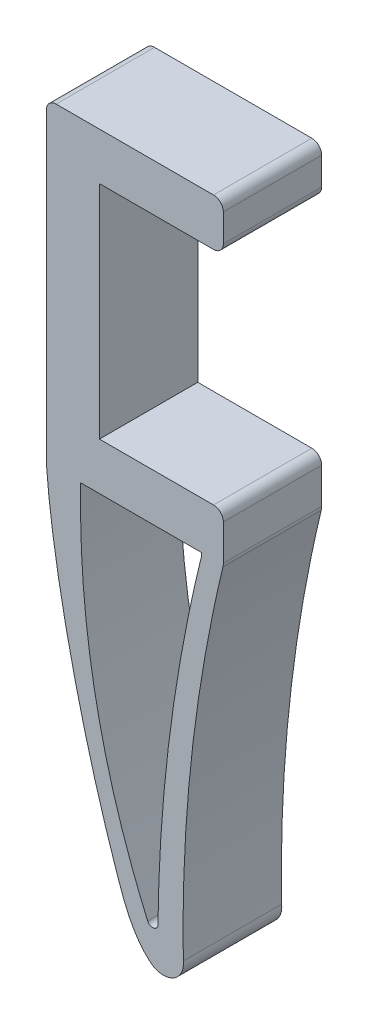
ISO-10303-21;
HEADER;
FILE_DESCRIPTION(('STEP AP214'),'2;1');
FILE_NAME('part.step','',(''),(''),'','','');
FILE_SCHEMA(('AUTOMOTIVE_DESIGN { 1 0 10303 214 1 1 1 1 }'));
ENDSEC;
DATA;
#1=APPLICATION_CONTEXT('core data for automotive mechanical design processes');
#2=APPLICATION_PROTOCOL_DEFINITION('international standard','automotive_design',2000,#1);
#3=PRODUCT_CONTEXT('',#1,'mechanical');
#4=PRODUCT('Part','Part','',(#3));
#5=PRODUCT_RELATED_PRODUCT_CATEGORY('part','',(#4));
#6=PRODUCT_DEFINITION_FORMATION('','',#4);
#7=PRODUCT_DEFINITION_CONTEXT('part definition',#1,'design');
#8=PRODUCT_DEFINITION('design','',#6,#7);
#9=PRODUCT_DEFINITION_SHAPE('','',#8);
#10=(LENGTH_UNIT() NAMED_UNIT(*) SI_UNIT(.MILLI.,.METRE.));
#11=(NAMED_UNIT(*) PLANE_ANGLE_UNIT() SI_UNIT($,.RADIAN.));
#12=(NAMED_UNIT(*) SI_UNIT($,.STERADIAN.) SOLID_ANGLE_UNIT());
#13=UNCERTAINTY_MEASURE_WITH_UNIT(LENGTH_MEASURE(1.E-05),#10,'distance_accuracy_value','');
#14=(GEOMETRIC_REPRESENTATION_CONTEXT(3) GLOBAL_UNCERTAINTY_ASSIGNED_CONTEXT((#13)) GLOBAL_UNIT_ASSIGNED_CONTEXT((#10,
#11,#12)) REPRESENTATION_CONTEXT('',''));
#15=CARTESIAN_POINT('',(0.,0.,0.));
#16=DIRECTION('',(0.,0.,1.));
#17=DIRECTION('',(1.,0.,0.));
#18=AXIS2_PLACEMENT_3D('',#15,#16,#17);
#19=CARTESIAN_POINT('',(-3.23658498725884,-50.5929421917792,10.));
#20=DIRECTION('',(0.,0.,-1.));
#21=DIRECTION('',(-1.,0.,0.));
#22=AXIS2_PLACEMENT_3D('',#19,#20,#21);
#23=PLANE('',#22);
#24=DIRECTION('',(0.,1.,0.));
#25=VECTOR('',#24,1.);
#26=CARTESIAN_POINT('',(0.,-31.9224715374172,10.));
#27=LINE('',#26,#25);
#28=CARTESIAN_POINT('',(0.,-31.9224715374172,10.));
#29=VERTEX_POINT('',#28);
#30=CARTESIAN_POINT('',(0.,-28.3,10.));
#31=VERTEX_POINT('',#30);
#32=EDGE_CURVE('E428',#29,#31,#27,.T.);
#33=ORIENTED_EDGE('',*,*,#32,.T.);
#34=CARTESIAN_POINT('',(-1.,-28.3,10.));
#35=DIRECTION('',(0.,0.,-1.));
#36=DIRECTION('',(-1.,0.,0.));
#37=AXIS2_PLACEMENT_3D('',#34,#35,#36);
#38=CIRCLE('',#37,1.);
#39=CARTESIAN_POINT('',(-1.,-27.3,10.));
#40=VERTEX_POINT('',#39);
#41=EDGE_CURVE('E382',#31,#40,#38,.F.);
#42=ORIENTED_EDGE('',*,*,#41,.T.);
#43=DIRECTION('',(-1.,0.,0.));
#44=VECTOR('',#43,1.);
#45=CARTESIAN_POINT('',(0.,-27.3,10.));
#46=LINE('',#45,#44);
#47=CARTESIAN_POINT('',(-12.6,-27.3,10.));
#48=VERTEX_POINT('',#47);
#49=EDGE_CURVE('E425',#40,#48,#46,.T.);
#50=ORIENTED_EDGE('',*,*,#49,.T.);
#51=DIRECTION('',(0.,1.,0.));
#52=VECTOR('',#51,1.);
#53=CARTESIAN_POINT('',(-12.6,-27.3,10.));
#54=LINE('',#53,#52);
#55=CARTESIAN_POINT('',(-12.6,-4.8,10.));
#56=VERTEX_POINT('',#55);
#57=EDGE_CURVE('E422',#48,#56,#54,.T.);
#58=ORIENTED_EDGE('',*,*,#57,.T.);
#59=DIRECTION('',(1.,0.,0.));
#60=VECTOR('',#59,1.);
#61=CARTESIAN_POINT('',(-12.6,-4.8,10.));
#62=LINE('',#61,#60);
#63=CARTESIAN_POINT('',(-1.,-4.8,10.));
#64=VERTEX_POINT('',#63);
#65=EDGE_CURVE('E419',#56,#64,#62,.T.);
#66=ORIENTED_EDGE('',*,*,#65,.T.);
#67=CARTESIAN_POINT('',(-1.,-3.8,10.));
#68=DIRECTION('',(0.,0.,-1.));
#69=DIRECTION('',(-1.,0.,0.));
#70=AXIS2_PLACEMENT_3D('',#67,#68,#69);
#71=CIRCLE('',#70,1.);
#72=CARTESIAN_POINT('',(0.,-3.8,10.));
#73=VERTEX_POINT('',#72);
#74=EDGE_CURVE('E55',#64,#73,#71,.F.);
#75=ORIENTED_EDGE('',*,*,#74,.T.);
#76=DIRECTION('',(0.,1.,0.));
#77=VECTOR('',#76,1.);
#78=CARTESIAN_POINT('',(0.,-4.8,10.));
#79=LINE('',#78,#77);
#80=CARTESIAN_POINT('',(0.,-1.,10.));
#81=VERTEX_POINT('',#80);
#82=EDGE_CURVE('E391',#73,#81,#79,.T.);
#83=ORIENTED_EDGE('',*,*,#82,.T.);
#84=CARTESIAN_POINT('',(-1.,-1.,10.));
#85=DIRECTION('',(0.,0.,1.));
#86=DIRECTION('',(1.,0.,0.));
#87=AXIS2_PLACEMENT_3D('',#84,#85,#86);
#88=CIRCLE('',#87,1.);
#89=CARTESIAN_POINT('',(-1.,0.,10.));
#90=VERTEX_POINT('',#89);
#91=EDGE_CURVE('E411',#81,#90,#88,.T.);
#92=ORIENTED_EDGE('',*,*,#91,.T.);
#93=DIRECTION('',(-1.,0.,0.));
#94=VECTOR('',#93,1.);
#95=CARTESIAN_POINT('',(-1.,0.,10.));
#96=LINE('',#95,#94);
#97=CARTESIAN_POINT('',(-17.,0.,10.));
#98=VERTEX_POINT('',#97);
#99=EDGE_CURVE('E407',#90,#98,#96,.T.);
#100=ORIENTED_EDGE('',*,*,#99,.T.);
#101=CARTESIAN_POINT('',(-17.,-1.,10.));
#102=DIRECTION('',(0.,0.,1.));
#103=DIRECTION('',(-1.,0.,0.));
#104=AXIS2_PLACEMENT_3D('',#101,#102,#103);
#105=CIRCLE('',#104,1.);
#106=CARTESIAN_POINT('',(-18.,-1.,10.));
#107=VERTEX_POINT('',#106);
#108=EDGE_CURVE('E410',#98,#107,#105,.T.);
#109=ORIENTED_EDGE('',*,*,#108,.T.);
#110=DIRECTION('',(0.,-1.,0.));
#111=VECTOR('',#110,1.);
#112=CARTESIAN_POINT('',(-18.,-1.,10.));
#113=LINE('',#112,#111);
#114=CARTESIAN_POINT('',(-18.,-32.1,10.));
#115=VERTEX_POINT('',#114);
#116=EDGE_CURVE('E265',#107,#115,#113,.T.);
#117=ORIENTED_EDGE('',*,*,#116,.T.);
#118=CARTESIAN_POINT('',(-18.,-32.1,10.));
#119=CARTESIAN_POINT('',(-17.398957494234,-40.620033006766,10.));
#120=CARTESIAN_POINT('',(-14.0240395925668,-56.3643003469999,10.));
#121=CARTESIAN_POINT('',(-9.14681542502628,-69.3203254230867,10.));
#122=CARTESIAN_POINT('',(-7.40639699949727,-70.7880822718513,10.));
#123=B_SPLINE_CURVE_WITH_KNOTS('',3,(#118,#119,#120,#121,#122),.UNSPECIFIED.,.F.,.F.,(4,1,4),
(0.,0.832203732575161,1.),.UNSPECIFIED.);
#124=CARTESIAN_POINT('',(-7.40639699949727,-70.7880822718513,10.));
#125=VERTEX_POINT('',#124);
#126=EDGE_CURVE('E257',#115,#125,#123,.T.);
#127=ORIENTED_EDGE('',*,*,#126,.T.);
#128=CARTESIAN_POINT('',(-6.09358347763843,-69.2313906136589,10.));
#129=DIRECTION('',(0.,0.,1.));
#130=DIRECTION('',(1.,0.,0.));
#131=AXIS2_PLACEMENT_3D('',#128,#129,#130);
#132=CIRCLE('',#131,2.03636152533416);
#133=CARTESIAN_POINT('',(-4.06994851749791,-69.0040806711611,10.));
#134=VERTEX_POINT('',#133);
#135=EDGE_CURVE('E264',#125,#134,#132,.T.);
#136=ORIENTED_EDGE('',*,*,#135,.T.);
#137=CARTESIAN_POINT('',(-4.06994851749792,-69.0040806711611,10.));
#138=CARTESIAN_POINT('',(-4.18582439782305,-62.852038397311,10.));
#139=CARTESIAN_POINT('',(-3.63024871100117,-50.5779460777402,10.));
#140=CARTESIAN_POINT('',(-1.50001812920996,-38.3638382143256,10.));
#141=CARTESIAN_POINT('',(-0.0412391145817272,-32.2717803967004,10.));
#142=B_SPLINE_CURVE_WITH_KNOTS('',3,(#137,#138,#139,#140,#141),.UNSPECIFIED.,.F.,.F.,(4,1,4),
(0.00417557910247349,0.448416270713421,0.892656962324368),.UNSPECIFIED.);
#143=CARTESIAN_POINT('',(-0.041239114581728,-32.2717803967004,10.));
#144=VERTEX_POINT('',#143);
#145=EDGE_CURVE('E323',#134,#144,#142,.T.);
#146=ORIENTED_EDGE('',*,*,#145,.T.);
#147=CARTESIAN_POINT('',(-1.5,-31.9224715374172,10.));
#148=DIRECTION('',(0.,0.,1.));
#149=DIRECTION('',(-1.,0.,0.));
#150=AXIS2_PLACEMENT_3D('',#147,#148,#149);
#151=CIRCLE('',#150,1.5);
#152=EDGE_CURVE('E432',#144,#29,#151,.T.);
#153=ORIENTED_EDGE('',*,*,#152,.T.);
#154=EDGE_LOOP('',(#33,#42,#50,#58,#66,#75,#83,#92,#100,#109,#117,#127,#136,#146,#153));
#155=FACE_BOUND('',#154,.T.);
#156=CARTESIAN_POINT('',(-6.64646223889354,-66.9903689496601,10.));
#157=CARTESIAN_POINT('',(-6.44058785307552,-49.5395325952305,10.));
#158=CARTESIAN_POINT('',(-2.20164076970151,-32.3439893671567,10.));
#159=B_SPLINE_CURVE_WITH_KNOTS('',2,(#156,#157,#158),.UNSPECIFIED.,.F.,.F.,(3,3),(0.,
0.915733771798747),.UNSPECIFIED.);
#160=CARTESIAN_POINT('',(-6.64646223889354,-66.9903689496601,10.));
#161=VERTEX_POINT('',#160);
#162=CARTESIAN_POINT('',(-2.20164076970151,-32.3439893671567,10.));
#163=VERTEX_POINT('',#162);
#164=EDGE_CURVE('E178',#161,#163,#159,.T.);
#165=ORIENTED_EDGE('',*,*,#164,.F.);
#166=CARTESIAN_POINT('',(-7.19131210735718,-67.0672502896794,10.));
#167=DIRECTION('',(0.,0.,1.));
#168=DIRECTION('',(1.,0.,0.));
#169=AXIS2_PLACEMENT_3D('',#166,#167,#168);
#170=CIRCLE('',#169,0.550247325852663);
#171=CARTESIAN_POINT('',(-7.69571393332645,-67.2871387103997,10.));
#172=VERTEX_POINT('',#171);
#173=EDGE_CURVE('E219',#172,#161,#170,.T.);
#174=ORIENTED_EDGE('',*,*,#173,.F.);
#175=CARTESIAN_POINT('',(-14.5029211951911,-32.1,10.));
#176=CARTESIAN_POINT('',(-14.7535147047283,-44.5732257051213,10.));
#177=CARTESIAN_POINT('',(-12.4844456174395,-56.3022719419212,10.));
#178=CARTESIAN_POINT('',(-7.69571393332645,-67.2871387103997,10.));
#179=B_SPLINE_CURVE_WITH_KNOTS('',3,(#175,#176,#177,#178),.UNSPECIFIED.,.F.,.F.,(4,4),(0.,1.),.UNSPECIFIED.);
#180=CARTESIAN_POINT('',(-14.5029211951911,-32.1,10.));
#181=VERTEX_POINT('',#180);
#182=EDGE_CURVE('E207',#181,#172,#179,.T.);
#183=ORIENTED_EDGE('',*,*,#182,.F.);
#184=DIRECTION('',(-1.,0.,0.));
#185=VECTOR('',#184,1.);
#186=CARTESIAN_POINT('',(-14.5029211951911,-32.1,10.));
#187=LINE('',#186,#185);
#188=CARTESIAN_POINT('',(-2.20164076970151,-32.1,10.));
#189=VERTEX_POINT('',#188);
#190=EDGE_CURVE('E203',#189,#181,#187,.T.);
#191=ORIENTED_EDGE('',*,*,#190,.F.);
#192=DIRECTION('',(0.,1.,0.));
#193=VECTOR('',#192,1.);
#194=CARTESIAN_POINT('',(-2.20164076970151,-32.1,10.));
#195=LINE('',#194,#193);
#196=EDGE_CURVE('E189',#163,#189,#195,.T.);
#197=ORIENTED_EDGE('',*,*,#196,.F.);
#198=EDGE_LOOP('',(#165,#174,#183,#191,#197));
#199=FACE_BOUND('',#198,.T.);
#200=ADVANCED_FACE('F39',(#155,#199),#23,.F.);
#201=CARTESIAN_POINT('',(-3.23658498725884,-50.5929421917792,0.));
#202=DIRECTION('',(0.,0.,-1.));
#203=DIRECTION('',(-1.,0.,0.));
#204=AXIS2_PLACEMENT_3D('',#201,#202,#203);
#205=PLANE('',#204);
#206=DIRECTION('',(-1.,0.,0.));
#207=VECTOR('',#206,1.);
#208=CARTESIAN_POINT('',(0.,-27.3,0.));
#209=LINE('',#208,#207);
#210=CARTESIAN_POINT('',(-1.,-27.3,0.));
#211=VERTEX_POINT('',#210);
#212=CARTESIAN_POINT('',(-12.6,-27.3,0.));
#213=VERTEX_POINT('',#212);
#214=EDGE_CURVE('E288',#211,#213,#209,.T.);
#215=ORIENTED_EDGE('',*,*,#214,.F.);
#216=CARTESIAN_POINT('',(-1.,-28.3,0.));
#217=DIRECTION('',(0.,0.,-1.));
#218=DIRECTION('',(-1.,0.,0.));
#219=AXIS2_PLACEMENT_3D('',#216,#217,#218);
#220=CIRCLE('',#219,1.);
#221=CARTESIAN_POINT('',(0.,-28.3,0.));
#222=VERTEX_POINT('',#221);
#223=EDGE_CURVE('E374',#211,#222,#220,.T.);
#224=ORIENTED_EDGE('',*,*,#223,.T.);
#225=DIRECTION('',(0.,1.,0.));
#226=VECTOR('',#225,1.);
#227=CARTESIAN_POINT('',(0.,-31.9224715374172,0.));
#228=LINE('',#227,#226);
#229=CARTESIAN_POINT('',(0.,-31.9224715374172,0.));
#230=VERTEX_POINT('',#229);
#231=EDGE_CURVE('E284',#230,#222,#228,.T.);
#232=ORIENTED_EDGE('',*,*,#231,.F.);
#233=CARTESIAN_POINT('',(-1.5,-31.9224715374172,0.));
#234=DIRECTION('',(0.,0.,1.));
#235=DIRECTION('',(-1.,0.,0.));
#236=AXIS2_PLACEMENT_3D('',#233,#234,#235);
#237=CIRCLE('',#236,1.5);
#238=CARTESIAN_POINT('',(-0.041239114581728,-32.2717803967004,0.));
#239=VERTEX_POINT('',#238);
#240=EDGE_CURVE('E278',#239,#230,#237,.T.);
#241=ORIENTED_EDGE('',*,*,#240,.F.);
#242=CARTESIAN_POINT('',(-4.06994851749792,-69.0040806711611,0.));
#243=CARTESIAN_POINT('',(-4.18582439782305,-62.852038397311,0.));
#244=CARTESIAN_POINT('',(-3.63024871100117,-50.5779460777402,0.));
#245=CARTESIAN_POINT('',(-1.50001812920996,-38.3638382143256,0.));
#246=CARTESIAN_POINT('',(-0.0412391145817272,-32.2717803967004,0.));
#247=B_SPLINE_CURVE_WITH_KNOTS('',3,(#242,#243,#244,#245,#246),.UNSPECIFIED.,.F.,.F.,(4,1,4),
(0.00417557910247349,0.448416270713421,0.892656962324368),.UNSPECIFIED.);
#248=CARTESIAN_POINT('',(-4.06994851749791,-69.0040806711611,0.));
#249=VERTEX_POINT('',#248);
#250=EDGE_CURVE('E198',#249,#239,#247,.T.);
#251=ORIENTED_EDGE('',*,*,#250,.F.);
#252=CARTESIAN_POINT('',(-6.09358347763843,-69.2313906136589,0.));
#253=DIRECTION('',(0.,0.,1.));
#254=DIRECTION('',(1.,0.,0.));
#255=AXIS2_PLACEMENT_3D('',#252,#253,#254);
#256=CIRCLE('',#255,2.03636152533416);
#257=CARTESIAN_POINT('',(-7.40639699949727,-70.7880822718513,0.));
#258=VERTEX_POINT('',#257);
#259=EDGE_CURVE('E317',#258,#249,#256,.T.);
#260=ORIENTED_EDGE('',*,*,#259,.F.);
#261=CARTESIAN_POINT('',(-18.,-32.1,0.));
#262=CARTESIAN_POINT('',(-17.398957494234,-40.620033006766,0.));
#263=CARTESIAN_POINT('',(-14.0240395925668,-56.3643003469999,0.));
#264=CARTESIAN_POINT('',(-9.14681542502628,-69.3203254230867,0.));
#265=CARTESIAN_POINT('',(-7.40639699949727,-70.7880822718513,0.));
#266=B_SPLINE_CURVE_WITH_KNOTS('',3,(#261,#262,#263,#264,#265),.UNSPECIFIED.,.F.,.F.,(4,1,4),
(0.,0.832203732575161,1.),.UNSPECIFIED.);
#267=CARTESIAN_POINT('',(-18.,-32.1,0.));
#268=VERTEX_POINT('',#267);
#269=EDGE_CURVE('E312',#268,#258,#266,.T.);
#270=ORIENTED_EDGE('',*,*,#269,.F.);
#271=DIRECTION('',(0.,-1.,0.));
#272=VECTOR('',#271,1.);
#273=CARTESIAN_POINT('',(-18.,-1.,0.));
#274=LINE('',#273,#272);
#275=CARTESIAN_POINT('',(-18.,-1.,0.));
#276=VERTEX_POINT('',#275);
#277=EDGE_CURVE('E309',#276,#268,#274,.T.);
#278=ORIENTED_EDGE('',*,*,#277,.F.);
#279=CARTESIAN_POINT('',(-17.,-1.,0.));
#280=DIRECTION('',(0.,0.,1.));
#281=DIRECTION('',(-1.,0.,0.));
#282=AXIS2_PLACEMENT_3D('',#279,#280,#281);
#283=CIRCLE('',#282,1.);
#284=CARTESIAN_POINT('',(-17.,0.,0.));
#285=VERTEX_POINT('',#284);
#286=EDGE_CURVE('E306',#285,#276,#283,.T.);
#287=ORIENTED_EDGE('',*,*,#286,.F.);
#288=DIRECTION('',(-1.,0.,0.));
#289=VECTOR('',#288,1.);
#290=CARTESIAN_POINT('',(-1.,0.,0.));
#291=LINE('',#290,#289);
#292=CARTESIAN_POINT('',(-1.,0.,0.));
#293=VERTEX_POINT('',#292);
#294=EDGE_CURVE('E303',#293,#285,#291,.T.);
#295=ORIENTED_EDGE('',*,*,#294,.F.);
#296=CARTESIAN_POINT('',(-1.,-1.,0.));
#297=DIRECTION('',(0.,0.,1.));
#298=DIRECTION('',(1.,0.,0.));
#299=AXIS2_PLACEMENT_3D('',#296,#297,#298);
#300=CIRCLE('',#299,1.);
#301=CARTESIAN_POINT('',(0.,-1.,0.));
#302=VERTEX_POINT('',#301);
#303=EDGE_CURVE('E300',#302,#293,#300,.T.);
#304=ORIENTED_EDGE('',*,*,#303,.F.);
#305=DIRECTION('',(0.,1.,0.));
#306=VECTOR('',#305,1.);
#307=CARTESIAN_POINT('',(0.,-4.8,0.));
#308=LINE('',#307,#306);
#309=CARTESIAN_POINT('',(0.,-3.8,0.));
#310=VERTEX_POINT('',#309);
#311=EDGE_CURVE('E297',#310,#302,#308,.T.);
#312=ORIENTED_EDGE('',*,*,#311,.F.);
#313=CARTESIAN_POINT('',(-1.,-3.8,0.));
#314=DIRECTION('',(0.,0.,-1.));
#315=DIRECTION('',(-1.,0.,0.));
#316=AXIS2_PLACEMENT_3D('',#313,#314,#315);
#317=CIRCLE('',#316,1.);
#318=CARTESIAN_POINT('',(-1.,-4.8,0.));
#319=VERTEX_POINT('',#318);
#320=EDGE_CURVE('E371',#310,#319,#317,.T.);
#321=ORIENTED_EDGE('',*,*,#320,.T.);
#322=DIRECTION('',(1.,0.,0.));
#323=VECTOR('',#322,1.);
#324=CARTESIAN_POINT('',(-12.6,-4.8,0.));
#325=LINE('',#324,#323);
#326=CARTESIAN_POINT('',(-12.6,-4.8,0.));
#327=VERTEX_POINT('',#326);
#328=EDGE_CURVE('E294',#327,#319,#325,.T.);
#329=ORIENTED_EDGE('',*,*,#328,.F.);
#330=DIRECTION('',(0.,1.,0.));
#331=VECTOR('',#330,1.);
#332=CARTESIAN_POINT('',(-12.6,-27.3,0.));
#333=LINE('',#332,#331);
#334=EDGE_CURVE('E291',#213,#327,#333,.T.);
#335=ORIENTED_EDGE('',*,*,#334,.F.);
#336=EDGE_LOOP('',(#215,#224,#232,#241,#251,#260,#270,#278,#287,#295,#304,#312,#321,#329,#335));
#337=FACE_BOUND('',#336,.T.);
#338=CARTESIAN_POINT('',(-7.19131210735718,-67.0672502896794,0.));
#339=DIRECTION('',(0.,0.,1.));
#340=DIRECTION('',(1.,0.,0.));
#341=AXIS2_PLACEMENT_3D('',#338,#339,#340);
#342=CIRCLE('',#341,0.550247325852663);
#343=CARTESIAN_POINT('',(-7.69571393332645,-67.2871387103997,0.));
#344=VERTEX_POINT('',#343);
#345=CARTESIAN_POINT('',(-6.64646223889354,-66.9903689496601,0.));
#346=VERTEX_POINT('',#345);
#347=EDGE_CURVE('E190',#344,#346,#342,.T.);
#348=ORIENTED_EDGE('',*,*,#347,.T.);
#349=CARTESIAN_POINT('',(-6.64646223889354,-66.9903689496601,0.));
#350=CARTESIAN_POINT('',(-6.44058785307552,-49.5395325952305,0.));
#351=CARTESIAN_POINT('',(-2.20164076970151,-32.3439893671567,0.));
#352=B_SPLINE_CURVE_WITH_KNOTS('',2,(#349,#350,#351),.UNSPECIFIED.,.F.,.F.,(3,3),(0.,
0.915733771798747),.UNSPECIFIED.);
#353=CARTESIAN_POINT('',(-2.20164076970151,-32.3439893671567,0.));
#354=VERTEX_POINT('',#353);
#355=EDGE_CURVE('E670',#346,#354,#352,.T.);
#356=ORIENTED_EDGE('',*,*,#355,.T.);
#357=DIRECTION('',(0.,1.,0.));
#358=VECTOR('',#357,1.);
#359=CARTESIAN_POINT('',(-2.20164076970151,-32.1,0.));
#360=LINE('',#359,#358);
#361=CARTESIAN_POINT('',(-2.20164076970151,-32.1,0.));
#362=VERTEX_POINT('',#361);
#363=EDGE_CURVE('E196',#354,#362,#360,.T.);
#364=ORIENTED_EDGE('',*,*,#363,.T.);
#365=DIRECTION('',(-1.,0.,0.));
#366=VECTOR('',#365,1.);
#367=CARTESIAN_POINT('',(-14.5029211951911,-32.1,0.));
#368=LINE('',#367,#366);
#369=CARTESIAN_POINT('',(-14.5029211951911,-32.1,0.));
#370=VERTEX_POINT('',#369);
#371=EDGE_CURVE('E650',#362,#370,#368,.T.);
#372=ORIENTED_EDGE('',*,*,#371,.T.);
#373=CARTESIAN_POINT('',(-14.5029211951911,-32.1,0.));
#374=CARTESIAN_POINT('',(-14.7535147047283,-44.5732257051213,0.));
#375=CARTESIAN_POINT('',(-12.4844456174395,-56.3022719419212,0.));
#376=CARTESIAN_POINT('',(-7.69571393332645,-67.2871387103997,0.));
#377=B_SPLINE_CURVE_WITH_KNOTS('',3,(#373,#374,#375,#376),.UNSPECIFIED.,.F.,.F.,(4,4),(0.,1.),.UNSPECIFIED.);
#378=EDGE_CURVE('E645',#370,#344,#377,.T.);
#379=ORIENTED_EDGE('',*,*,#378,.T.);
#380=EDGE_LOOP('',(#348,#356,#364,#372,#379));
#381=FACE_BOUND('',#380,.T.);
#382=ADVANCED_FACE('F242',(#337,#381),#205,.T.);
#383=DIRECTION('',(0.,0.,-1.));
#384=VECTOR('',#383,1.);
#385=SURFACE_OF_LINEAR_EXTRUSION('',#142,#384);
#386=ORIENTED_EDGE('',*,*,#250,.T.);
#387=DIRECTION('',(0.,0.,-1.));
#388=VECTOR('',#387,1.);
#389=CARTESIAN_POINT('',(-0.041239114581728,-32.2717803967004,10.));
#390=LINE('',#389,#388);
#391=EDGE_CURVE('E363',#144,#239,#390,.T.);
#392=ORIENTED_EDGE('',*,*,#391,.F.);
#393=ORIENTED_EDGE('',*,*,#145,.F.);
#394=DIRECTION('',(0.,0.,-1.));
#395=VECTOR('',#394,1.);
#396=CARTESIAN_POINT('',(-4.06994851749791,-69.0040806711611,10.));
#397=LINE('',#396,#395);
#398=EDGE_CURVE('E272',#134,#249,#397,.T.);
#399=ORIENTED_EDGE('',*,*,#398,.T.);
#400=EDGE_LOOP('',(#386,#392,#393,#399));
#401=FACE_BOUND('',#400,.T.);
#402=ADVANCED_FACE('F245',(#401),#385,.F.);
#403=CARTESIAN_POINT('',(-1.5,-31.9224715374172,10.));
#404=DIRECTION('',(0.,0.,-1.));
#405=DIRECTION('',(-1.,0.,0.));
#406=AXIS2_PLACEMENT_3D('',#403,#404,#405);
#407=CYLINDRICAL_SURFACE('',#406,1.5);
#408=ORIENTED_EDGE('',*,*,#240,.T.);
#409=DIRECTION('',(0.,0.,-1.));
#410=VECTOR('',#409,1.);
#411=CARTESIAN_POINT('',(0.,-31.9224715374172,10.));
#412=LINE('',#411,#410);
#413=EDGE_CURVE('E359',#29,#230,#412,.T.);
#414=ORIENTED_EDGE('',*,*,#413,.F.);
#415=ORIENTED_EDGE('',*,*,#152,.F.);
#416=ORIENTED_EDGE('',*,*,#391,.T.);
#417=EDGE_LOOP('',(#408,#414,#415,#416));
#418=FACE_BOUND('',#417,.T.);
#419=ADVANCED_FACE('F447',(#418),#407,.T.);
#420=CARTESIAN_POINT('',(0.,-31.9224715374172,10.));
#421=DIRECTION('',(-1.,0.,0.));
#422=DIRECTION('',(0.,0.,1.));
#423=AXIS2_PLACEMENT_3D('',#420,#421,#422);
#424=PLANE('',#423);
#425=ORIENTED_EDGE('',*,*,#231,.T.);
#426=DIRECTION('',(0.,0.,-1.));
#427=VECTOR('',#426,1.);
#428=CARTESIAN_POINT('',(0.,-28.3,10.));
#429=LINE('',#428,#427);
#430=EDGE_CURVE('E377',#222,#31,#429,.F.);
#431=ORIENTED_EDGE('',*,*,#430,.T.);
#432=ORIENTED_EDGE('',*,*,#32,.F.);
#433=ORIENTED_EDGE('',*,*,#413,.T.);
#434=EDGE_LOOP('',(#425,#431,#432,#433));
#435=FACE_BOUND('',#434,.T.);
#436=ADVANCED_FACE('F474',(#435),#424,.F.);
#437=CARTESIAN_POINT('',(0.,-27.3,10.));
#438=DIRECTION('',(0.,-1.,0.));
#439=DIRECTION('',(0.,0.,-1.));
#440=AXIS2_PLACEMENT_3D('',#437,#438,#439);
#441=PLANE('',#440);
#442=ORIENTED_EDGE('',*,*,#49,.F.);
#443=DIRECTION('',(0.,0.,-1.));
#444=VECTOR('',#443,1.);
#445=CARTESIAN_POINT('',(-1.,-27.3,10.));
#446=LINE('',#445,#444);
#447=EDGE_CURVE('E367',#40,#211,#446,.T.);
#448=ORIENTED_EDGE('',*,*,#447,.T.);
#449=ORIENTED_EDGE('',*,*,#214,.T.);
#450=DIRECTION('',(0.,0.,-1.));
#451=VECTOR('',#450,1.);
#452=CARTESIAN_POINT('',(-12.6,-27.3,10.));
#453=LINE('',#452,#451);
#454=EDGE_CURVE('E355',#48,#213,#453,.T.);
#455=ORIENTED_EDGE('',*,*,#454,.F.);
#456=EDGE_LOOP('',(#442,#448,#449,#455));
#457=FACE_BOUND('',#456,.T.);
#458=ADVANCED_FACE('F465',(#457),#441,.F.);
#459=CARTESIAN_POINT('',(-12.6,-27.3,10.));
#460=DIRECTION('',(-1.,0.,0.));
#461=DIRECTION('',(0.,0.,1.));
#462=AXIS2_PLACEMENT_3D('',#459,#460,#461);
#463=PLANE('',#462);
#464=ORIENTED_EDGE('',*,*,#334,.T.);
#465=DIRECTION('',(0.,0.,-1.));
#466=VECTOR('',#465,1.);
#467=CARTESIAN_POINT('',(-12.6,-4.8,10.));
#468=LINE('',#467,#466);
#469=EDGE_CURVE('E351',#56,#327,#468,.T.);
#470=ORIENTED_EDGE('',*,*,#469,.F.);
#471=ORIENTED_EDGE('',*,*,#57,.F.);
#472=ORIENTED_EDGE('',*,*,#454,.T.);
#473=EDGE_LOOP('',(#464,#470,#471,#472));
#474=FACE_BOUND('',#473,.T.);
#475=ADVANCED_FACE('F470',(#474),#463,.F.);
#476=CARTESIAN_POINT('',(-12.6,-4.8,10.));
#477=DIRECTION('',(0.,1.,0.));
#478=DIRECTION('',(0.,0.,1.));
#479=AXIS2_PLACEMENT_3D('',#476,#477,#478);
#480=PLANE('',#479);
#481=ORIENTED_EDGE('',*,*,#328,.T.);
#482=DIRECTION('',(0.,0.,-1.));
#483=VECTOR('',#482,1.);
#484=CARTESIAN_POINT('',(-1.,-4.8,10.));
#485=LINE('',#484,#483);
#486=EDGE_CURVE('E11',#319,#64,#485,.F.);
#487=ORIENTED_EDGE('',*,*,#486,.T.);
#488=ORIENTED_EDGE('',*,*,#65,.F.);
#489=ORIENTED_EDGE('',*,*,#469,.T.);
#490=EDGE_LOOP('',(#481,#487,#488,#489));
#491=FACE_BOUND('',#490,.T.);
#492=ADVANCED_FACE('F471',(#491),#480,.F.);
#493=CARTESIAN_POINT('',(0.,-4.8,10.));
#494=DIRECTION('',(-1.,0.,0.));
#495=DIRECTION('',(0.,0.,1.));
#496=AXIS2_PLACEMENT_3D('',#493,#494,#495);
#497=PLANE('',#496);
#498=ORIENTED_EDGE('',*,*,#82,.F.);
#499=DIRECTION('',(0.,0.,-1.));
#500=VECTOR('',#499,1.);
#501=CARTESIAN_POINT('',(0.,-3.8,10.));
#502=LINE('',#501,#500);
#503=EDGE_CURVE('E48',#73,#310,#502,.T.);
#504=ORIENTED_EDGE('',*,*,#503,.T.);
#505=ORIENTED_EDGE('',*,*,#311,.T.);
#506=DIRECTION('',(0.,0.,-1.));
#507=VECTOR('',#506,1.);
#508=CARTESIAN_POINT('',(0.,-1.,10.));
#509=LINE('',#508,#507);
#510=EDGE_CURVE('E347',#81,#302,#509,.T.);
#511=ORIENTED_EDGE('',*,*,#510,.F.);
#512=EDGE_LOOP('',(#498,#504,#505,#511));
#513=FACE_BOUND('',#512,.T.);
#514=ADVANCED_FACE('F389',(#513),#497,.F.);
#515=CARTESIAN_POINT('',(-1.,-1.,10.));
#516=DIRECTION('',(0.,0.,-1.));
#517=DIRECTION('',(-1.,0.,0.));
#518=AXIS2_PLACEMENT_3D('',#515,#516,#517);
#519=CYLINDRICAL_SURFACE('',#518,1.);
#520=ORIENTED_EDGE('',*,*,#303,.T.);
#521=DIRECTION('',(0.,0.,-1.));
#522=VECTOR('',#521,1.);
#523=CARTESIAN_POINT('',(-1.,0.,10.));
#524=LINE('',#523,#522);
#525=EDGE_CURVE('E343',#90,#293,#524,.T.);
#526=ORIENTED_EDGE('',*,*,#525,.F.);
#527=ORIENTED_EDGE('',*,*,#91,.F.);
#528=ORIENTED_EDGE('',*,*,#510,.T.);
#529=EDGE_LOOP('',(#520,#526,#527,#528));
#530=FACE_BOUND('',#529,.T.);
#531=ADVANCED_FACE('F401',(#530),#519,.T.);
#532=CARTESIAN_POINT('',(-1.,0.,10.));
#533=DIRECTION('',(0.,-1.,0.));
#534=DIRECTION('',(1.,0.,0.));
#535=AXIS2_PLACEMENT_3D('',#532,#533,#534);
#536=PLANE('',#535);
#537=ORIENTED_EDGE('',*,*,#294,.T.);
#538=DIRECTION('',(0.,0.,-1.));
#539=VECTOR('',#538,1.);
#540=CARTESIAN_POINT('',(-17.,0.,10.));
#541=LINE('',#540,#539);
#542=EDGE_CURVE('E339',#98,#285,#541,.T.);
#543=ORIENTED_EDGE('',*,*,#542,.F.);
#544=ORIENTED_EDGE('',*,*,#99,.F.);
#545=ORIENTED_EDGE('',*,*,#525,.T.);
#546=EDGE_LOOP('',(#537,#543,#544,#545));
#547=FACE_BOUND('',#546,.T.);
#548=ADVANCED_FACE('F405',(#547),#536,.F.);
#549=CARTESIAN_POINT('',(-17.,-1.,10.));
#550=DIRECTION('',(0.,0.,-1.));
#551=DIRECTION('',(-1.,0.,0.));
#552=AXIS2_PLACEMENT_3D('',#549,#550,#551);
#553=CYLINDRICAL_SURFACE('',#552,1.);
#554=ORIENTED_EDGE('',*,*,#286,.T.);
#555=DIRECTION('',(0.,0.,-1.));
#556=VECTOR('',#555,1.);
#557=CARTESIAN_POINT('',(-18.,-1.,10.));
#558=LINE('',#557,#556);
#559=EDGE_CURVE('E335',#107,#276,#558,.T.);
#560=ORIENTED_EDGE('',*,*,#559,.F.);
#561=ORIENTED_EDGE('',*,*,#108,.F.);
#562=ORIENTED_EDGE('',*,*,#542,.T.);
#563=EDGE_LOOP('',(#554,#560,#561,#562));
#564=FACE_BOUND('',#563,.T.);
#565=ADVANCED_FACE('F492',(#564),#553,.T.);
#566=CARTESIAN_POINT('',(-18.,-1.,10.));
#567=DIRECTION('',(1.,0.,0.));
#568=DIRECTION('',(0.,1.,0.));
#569=AXIS2_PLACEMENT_3D('',#566,#567,#568);
#570=PLANE('',#569);
#571=ORIENTED_EDGE('',*,*,#277,.T.);
#572=DIRECTION('',(0.,0.,-1.));
#573=VECTOR('',#572,1.);
#574=CARTESIAN_POINT('',(-18.,-32.1,10.));
#575=LINE('',#574,#573);
#576=EDGE_CURVE('E331',#115,#268,#575,.T.);
#577=ORIENTED_EDGE('',*,*,#576,.F.);
#578=ORIENTED_EDGE('',*,*,#116,.F.);
#579=ORIENTED_EDGE('',*,*,#559,.T.);
#580=EDGE_LOOP('',(#571,#577,#578,#579));
#581=FACE_BOUND('',#580,.T.);
#582=ADVANCED_FACE('F254',(#581),#570,.F.);
#583=DIRECTION('',(0.,0.,-1.));
#584=VECTOR('',#583,1.);
#585=SURFACE_OF_LINEAR_EXTRUSION('',#123,#584);
#586=ORIENTED_EDGE('',*,*,#269,.T.);
#587=DIRECTION('',(0.,0.,-1.));
#588=VECTOR('',#587,1.);
#589=CARTESIAN_POINT('',(-7.40639699949727,-70.7880822718513,10.));
#590=LINE('',#589,#588);
#591=EDGE_CURVE('E327',#125,#258,#590,.T.);
#592=ORIENTED_EDGE('',*,*,#591,.F.);
#593=ORIENTED_EDGE('',*,*,#126,.F.);
#594=ORIENTED_EDGE('',*,*,#576,.T.);
#595=EDGE_LOOP('',(#586,#592,#593,#594));
#596=FACE_BOUND('',#595,.T.);
#597=ADVANCED_FACE('F249',(#596),#585,.F.);
#598=CARTESIAN_POINT('',(-6.09358347763843,-69.2313906136589,10.));
#599=DIRECTION('',(0.,0.,-1.));
#600=DIRECTION('',(-1.,0.,0.));
#601=AXIS2_PLACEMENT_3D('',#598,#599,#600);
#602=CYLINDRICAL_SURFACE('',#601,2.03636152533416);
#603=ORIENTED_EDGE('',*,*,#259,.T.);
#604=ORIENTED_EDGE('',*,*,#398,.F.);
#605=ORIENTED_EDGE('',*,*,#135,.F.);
#606=ORIENTED_EDGE('',*,*,#591,.T.);
#607=EDGE_LOOP('',(#603,#604,#605,#606));
#608=FACE_BOUND('',#607,.T.);
#609=ADVANCED_FACE('F239',(#608),#602,.T.);
#610=DIRECTION('',(0.,0.,-1.));
#611=VECTOR('',#610,1.);
#612=SURFACE_OF_LINEAR_EXTRUSION('',#159,#611);
#613=ORIENTED_EDGE('',*,*,#355,.F.);
#614=DIRECTION('',(0.,0.,-1.));
#615=VECTOR('',#614,1.);
#616=CARTESIAN_POINT('',(-6.64646223889354,-66.9903689496601,10.));
#617=LINE('',#616,#615);
#618=EDGE_CURVE('E184',#161,#346,#617,.T.);
#619=ORIENTED_EDGE('',*,*,#618,.F.);
#620=ORIENTED_EDGE('',*,*,#164,.T.);
#621=DIRECTION('',(0.,0.,-1.));
#622=VECTOR('',#621,1.);
#623=CARTESIAN_POINT('',(-2.20164076970151,-32.3439893671567,10.));
#624=LINE('',#623,#622);
#625=EDGE_CURVE('E181',#163,#354,#624,.T.);
#626=ORIENTED_EDGE('',*,*,#625,.T.);
#627=EDGE_LOOP('',(#613,#619,#620,#626));
#628=FACE_BOUND('',#627,.T.);
#629=ADVANCED_FACE('F180',(#628),#612,.T.);
#630=CARTESIAN_POINT('',(-2.20164076970151,-32.1,10.));
#631=DIRECTION('',(-1.,0.,0.));
#632=DIRECTION('',(0.,-1.,0.));
#633=AXIS2_PLACEMENT_3D('',#630,#631,#632);
#634=PLANE('',#633);
#635=ORIENTED_EDGE('',*,*,#363,.F.);
#636=ORIENTED_EDGE('',*,*,#625,.F.);
#637=ORIENTED_EDGE('',*,*,#196,.T.);
#638=DIRECTION('',(0.,0.,-1.));
#639=VECTOR('',#638,1.);
#640=CARTESIAN_POINT('',(-2.20164076970151,-32.1,10.));
#641=LINE('',#640,#639);
#642=EDGE_CURVE('E199',#189,#362,#641,.T.);
#643=ORIENTED_EDGE('',*,*,#642,.T.);
#644=EDGE_LOOP('',(#635,#636,#637,#643));
#645=FACE_BOUND('',#644,.T.);
#646=ADVANCED_FACE('F193',(#645),#634,.T.);
#647=CARTESIAN_POINT('',(-14.5029211951911,-32.1,10.));
#648=DIRECTION('',(0.,-1.,0.));
#649=DIRECTION('',(0.,0.,-1.));
#650=AXIS2_PLACEMENT_3D('',#647,#648,#649);
#651=PLANE('',#650);
#652=ORIENTED_EDGE('',*,*,#371,.F.);
#653=ORIENTED_EDGE('',*,*,#642,.F.);
#654=ORIENTED_EDGE('',*,*,#190,.T.);
#655=DIRECTION('',(0.,0.,-1.));
#656=VECTOR('',#655,1.);
#657=CARTESIAN_POINT('',(-14.5029211951911,-32.1,10.));
#658=LINE('',#657,#656);
#659=EDGE_CURVE('E667',#181,#370,#658,.T.);
#660=ORIENTED_EDGE('',*,*,#659,.T.);
#661=EDGE_LOOP('',(#652,#653,#654,#660));
#662=FACE_BOUND('',#661,.T.);
#663=ADVANCED_FACE('F230',(#662),#651,.T.);
#664=DIRECTION('',(0.,0.,-1.));
#665=VECTOR('',#664,1.);
#666=SURFACE_OF_LINEAR_EXTRUSION('',#179,#665);
#667=ORIENTED_EDGE('',*,*,#378,.F.);
#668=ORIENTED_EDGE('',*,*,#659,.F.);
#669=ORIENTED_EDGE('',*,*,#182,.T.);
#670=DIRECTION('',(0.,0.,-1.));
#671=VECTOR('',#670,1.);
#672=CARTESIAN_POINT('',(-7.69571393332645,-67.2871387103997,10.));
#673=LINE('',#672,#671);
#674=EDGE_CURVE('E643',#172,#344,#673,.T.);
#675=ORIENTED_EDGE('',*,*,#674,.T.);
#676=EDGE_LOOP('',(#667,#668,#669,#675));
#677=FACE_BOUND('',#676,.T.);
#678=ADVANCED_FACE('F225',(#677),#666,.T.);
#679=CARTESIAN_POINT('',(-7.19131210735718,-67.0672502896794,10.));
#680=DIRECTION('',(0.,0.,-1.));
#681=DIRECTION('',(-1.,0.,0.));
#682=AXIS2_PLACEMENT_3D('',#679,#680,#681);
#683=CYLINDRICAL_SURFACE('',#682,0.550247325852663);
#684=ORIENTED_EDGE('',*,*,#347,.F.);
#685=ORIENTED_EDGE('',*,*,#674,.F.);
#686=ORIENTED_EDGE('',*,*,#173,.T.);
#687=ORIENTED_EDGE('',*,*,#618,.T.);
#688=EDGE_LOOP('',(#684,#685,#686,#687));
#689=FACE_BOUND('',#688,.T.);
#690=ADVANCED_FACE('F229',(#689),#683,.F.);
#691=CARTESIAN_POINT('',(-1.,-28.3,10.));
#692=DIRECTION('',(0.,0.,-1.));
#693=DIRECTION('',(-1.,0.,0.));
#694=AXIS2_PLACEMENT_3D('',#691,#692,#693);
#695=CYLINDRICAL_SURFACE('',#694,1.);
#696=ORIENTED_EDGE('',*,*,#41,.F.);
#697=ORIENTED_EDGE('',*,*,#430,.F.);
#698=ORIENTED_EDGE('',*,*,#223,.F.);
#699=ORIENTED_EDGE('',*,*,#447,.F.);
#700=EDGE_LOOP('',(#696,#697,#698,#699));
#701=FACE_BOUND('',#700,.T.);
#702=ADVANCED_FACE('F450',(#701),#695,.T.);
#703=CARTESIAN_POINT('',(-1.,-3.8,10.));
#704=DIRECTION('',(0.,0.,-1.));
#705=DIRECTION('',(-1.,0.,0.));
#706=AXIS2_PLACEMENT_3D('',#703,#704,#705);
#707=CYLINDRICAL_SURFACE('',#706,1.);
#708=ORIENTED_EDGE('',*,*,#74,.F.);
#709=ORIENTED_EDGE('',*,*,#486,.F.);
#710=ORIENTED_EDGE('',*,*,#320,.F.);
#711=ORIENTED_EDGE('',*,*,#503,.F.);
#712=EDGE_LOOP('',(#708,#709,#710,#711));
#713=FACE_BOUND('',#712,.T.);
#714=ADVANCED_FACE('F41',(#713),#707,.T.);
#715=CLOSED_SHELL('',(#200,#382,#402,#419,#436,#458,#475,#492,#514,#531,#548,#565,#582,#597,
#609,#629,#646,#663,#678,#690,#702,#714));
#716=MANIFOLD_SOLID_BREP('B2',#715);
#717=ADVANCED_BREP_SHAPE_REPRESENTATION('',(#18,#716),#14);
#718=SHAPE_DEFINITION_REPRESENTATION(#9,#717);
ENDSEC;
END-ISO-10303-21;
